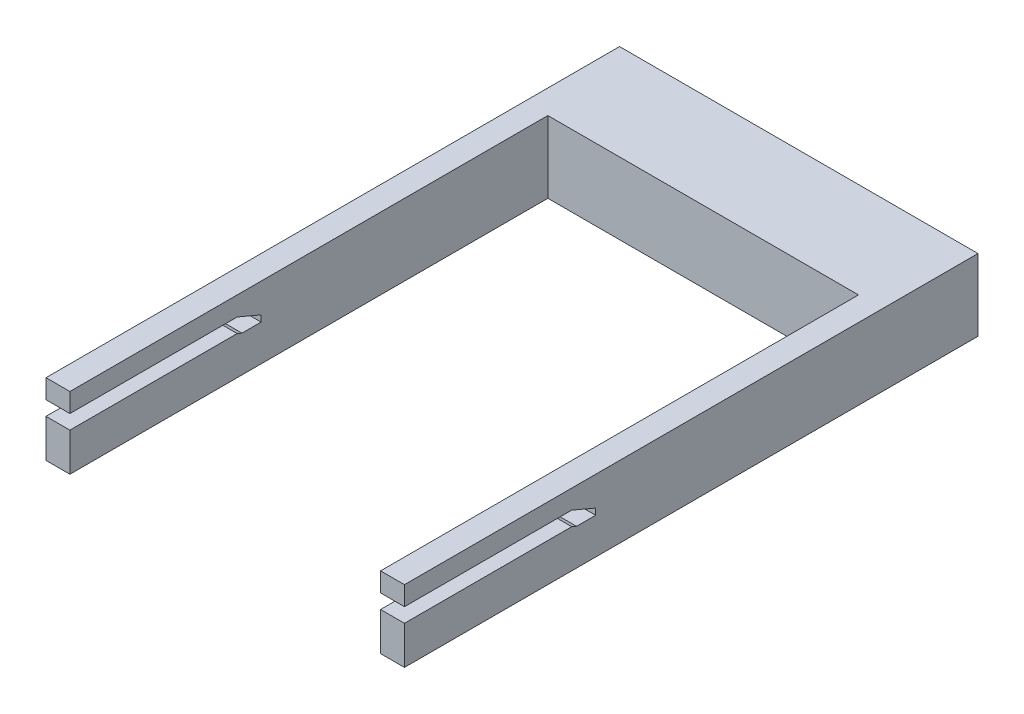
ISO-10303-21;
HEADER;
FILE_DESCRIPTION(('STEP AP214'),'2;1');
FILE_NAME('part.step','',(''),(''),'','','');
FILE_SCHEMA(('AUTOMOTIVE_DESIGN { 1 0 10303 214 1 1 1 1 }'));
ENDSEC;
DATA;
#1=APPLICATION_CONTEXT('core data for automotive mechanical design processes');
#2=APPLICATION_PROTOCOL_DEFINITION('international standard','automotive_design',2000,#1);
#3=PRODUCT_CONTEXT('',#1,'mechanical');
#4=PRODUCT('Part','Part','',(#3));
#5=PRODUCT_RELATED_PRODUCT_CATEGORY('part','',(#4));
#6=PRODUCT_DEFINITION_FORMATION('','',#4);
#7=PRODUCT_DEFINITION_CONTEXT('part definition',#1,'design');
#8=PRODUCT_DEFINITION('design','',#6,#7);
#9=PRODUCT_DEFINITION_SHAPE('','',#8);
#10=(LENGTH_UNIT() NAMED_UNIT(*) SI_UNIT(.MILLI.,.METRE.));
#11=(NAMED_UNIT(*) PLANE_ANGLE_UNIT() SI_UNIT($,.RADIAN.));
#12=(NAMED_UNIT(*) SI_UNIT($,.STERADIAN.) SOLID_ANGLE_UNIT());
#13=UNCERTAINTY_MEASURE_WITH_UNIT(LENGTH_MEASURE(1.E-05),#10,'distance_accuracy_value','');
#14=(GEOMETRIC_REPRESENTATION_CONTEXT(3) GLOBAL_UNCERTAINTY_ASSIGNED_CONTEXT((#13)) GLOBAL_UNIT_ASSIGNED_CONTEXT((#10,
#11,#12)) REPRESENTATION_CONTEXT('',''));
#15=CARTESIAN_POINT('',(0.,0.,0.));
#16=DIRECTION('',(0.,0.,1.));
#17=DIRECTION('',(1.,0.,0.));
#18=AXIS2_PLACEMENT_3D('',#15,#16,#17);
#19=CARTESIAN_POINT('',(-37.5,15.,60.));
#20=DIRECTION('',(0.,0.,-1.));
#21=DIRECTION('',(-1.,0.,0.));
#22=AXIS2_PLACEMENT_3D('',#19,#20,#21);
#23=PLANE('',#22);
#24=DIRECTION('',(0.,-1.,0.));
#25=VECTOR('',#24,1.);
#26=CARTESIAN_POINT('',(-37.5,15.,60.));
#27=LINE('',#26,#25);
#28=CARTESIAN_POINT('',(-37.5,15.,60.));
#29=VERTEX_POINT('',#28);
#30=CARTESIAN_POINT('',(-37.5,11.,60.));
#31=VERTEX_POINT('',#30);
#32=EDGE_CURVE('E222',#29,#31,#27,.T.);
#33=ORIENTED_EDGE('',*,*,#32,.T.);
#34=DIRECTION('',(1.,0.,0.));
#35=VECTOR('',#34,1.);
#36=CARTESIAN_POINT('',(-37.5,11.,60.));
#37=LINE('',#36,#35);
#38=CARTESIAN_POINT('',(-32.5,11.,60.));
#39=VERTEX_POINT('',#38);
#40=EDGE_CURVE('E291',#31,#39,#37,.T.);
#41=ORIENTED_EDGE('',*,*,#40,.T.);
#42=DIRECTION('',(0.,-1.,0.));
#43=VECTOR('',#42,1.);
#44=CARTESIAN_POINT('',(-32.5,15.,60.));
#45=LINE('',#44,#43);
#46=CARTESIAN_POINT('',(-32.5,15.,60.));
#47=VERTEX_POINT('',#46);
#48=EDGE_CURVE('E223',#47,#39,#45,.T.);
#49=ORIENTED_EDGE('',*,*,#48,.F.);
#50=DIRECTION('',(1.,0.,0.));
#51=VECTOR('',#50,1.);
#52=CARTESIAN_POINT('',(-37.5,15.,60.));
#53=LINE('',#52,#51);
#54=EDGE_CURVE('E329',#29,#47,#53,.T.);
#55=ORIENTED_EDGE('',*,*,#54,.F.);
#56=EDGE_LOOP('',(#33,#41,#49,#55));
#57=FACE_BOUND('',#56,.T.);
#58=ADVANCED_FACE('F43',(#57),#23,.F.);
#59=CARTESIAN_POINT('',(32.5,15.,60.));
#60=DIRECTION('',(0.,0.,-1.));
#61=DIRECTION('',(-1.,0.,0.));
#62=AXIS2_PLACEMENT_3D('',#59,#60,#61);
#63=PLANE('',#62);
#64=DIRECTION('',(0.,-1.,0.));
#65=VECTOR('',#64,1.);
#66=CARTESIAN_POINT('',(32.5,15.,60.));
#67=LINE('',#66,#65);
#68=CARTESIAN_POINT('',(32.5,15.,60.));
#69=VERTEX_POINT('',#68);
#70=CARTESIAN_POINT('',(32.5,11.,60.));
#71=VERTEX_POINT('',#70);
#72=EDGE_CURVE('E374',#69,#71,#67,.T.);
#73=ORIENTED_EDGE('',*,*,#72,.T.);
#74=DIRECTION('',(1.,0.,0.));
#75=VECTOR('',#74,1.);
#76=CARTESIAN_POINT('',(32.5,11.,60.));
#77=LINE('',#76,#75);
#78=CARTESIAN_POINT('',(37.5,11.,60.));
#79=VERTEX_POINT('',#78);
#80=EDGE_CURVE('E242',#71,#79,#77,.T.);
#81=ORIENTED_EDGE('',*,*,#80,.T.);
#82=DIRECTION('',(0.,-1.,0.));
#83=VECTOR('',#82,1.);
#84=CARTESIAN_POINT('',(37.5,15.,60.));
#85=LINE('',#84,#83);
#86=CARTESIAN_POINT('',(37.5,15.,60.));
#87=VERTEX_POINT('',#86);
#88=EDGE_CURVE('E369',#87,#79,#85,.T.);
#89=ORIENTED_EDGE('',*,*,#88,.F.);
#90=DIRECTION('',(1.,0.,0.));
#91=VECTOR('',#90,1.);
#92=CARTESIAN_POINT('',(32.5,15.,60.));
#93=LINE('',#92,#91);
#94=EDGE_CURVE('E341',#69,#87,#93,.T.);
#95=ORIENTED_EDGE('',*,*,#94,.F.);
#96=EDGE_LOOP('',(#73,#81,#89,#95));
#97=FACE_BOUND('',#96,.T.);
#98=ADVANCED_FACE('F483',(#97),#63,.F.);
#99=CARTESIAN_POINT('',(37.5,15.,-60.));
#100=DIRECTION('',(-1.,0.,0.));
#101=DIRECTION('',(0.,0.,1.));
#102=AXIS2_PLACEMENT_3D('',#99,#100,#101);
#103=PLANE('',#102);
#104=ORIENTED_EDGE('',*,*,#88,.T.);
#105=DIRECTION('',(0.,0.,1.));
#106=VECTOR('',#105,1.);
#107=CARTESIAN_POINT('',(37.5,11.,60.));
#108=LINE('',#107,#106);
#109=CARTESIAN_POINT('',(37.5,11.,25.));
#110=VERTEX_POINT('',#109);
#111=EDGE_CURVE('E202',#110,#79,#108,.T.);
#112=ORIENTED_EDGE('',*,*,#111,.F.);
#113=DIRECTION('',(0.,0.390731128489274,0.92050485345244));
#114=VECTOR('',#113,1.);
#115=CARTESIAN_POINT('',(37.5,11.,25.));
#116=LINE('',#115,#114);
#117=CARTESIAN_POINT('',(37.5,8.87762591895197,20.));
#118=VERTEX_POINT('',#117);
#119=EDGE_CURVE('E424',#118,#110,#116,.T.);
#120=ORIENTED_EDGE('',*,*,#119,.F.);
#121=DIRECTION('',(0.,1.,0.));
#122=VECTOR('',#121,1.);
#123=CARTESIAN_POINT('',(37.5,8.87762591895197,20.));
#124=LINE('',#123,#122);
#125=CARTESIAN_POINT('',(37.5,7.5755251837904,20.));
#126=VERTEX_POINT('',#125);
#127=EDGE_CURVE('E428',#126,#118,#124,.T.);
#128=ORIENTED_EDGE('',*,*,#127,.F.);
#129=DIRECTION('',(0.,0.,-1.));
#130=VECTOR('',#129,1.);
#131=CARTESIAN_POINT('',(37.5,7.5755251837904,20.));
#132=LINE('',#131,#130);
#133=CARTESIAN_POINT('',(37.5,7.57552518379039,24.));
#134=VERTEX_POINT('',#133);
#135=EDGE_CURVE('E270',#134,#126,#132,.T.);
#136=ORIENTED_EDGE('',*,*,#135,.F.);
#137=DIRECTION('',(0.,-0.390731128489276,-0.920504853452439));
#138=VECTOR('',#137,1.);
#139=CARTESIAN_POINT('',(37.5,7.57552518379039,24.));
#140=LINE('',#139,#138);
#141=CARTESIAN_POINT('',(37.5,8.,25.));
#142=VERTEX_POINT('',#141);
#143=EDGE_CURVE('E433',#142,#134,#140,.T.);
#144=ORIENTED_EDGE('',*,*,#143,.F.);
#145=DIRECTION('',(0.,0.,-1.));
#146=VECTOR('',#145,1.);
#147=CARTESIAN_POINT('',(37.5,8.,25.));
#148=LINE('',#147,#146);
#149=CARTESIAN_POINT('',(37.5,8.,60.));
#150=VERTEX_POINT('',#149);
#151=EDGE_CURVE('E437',#150,#142,#148,.T.);
#152=ORIENTED_EDGE('',*,*,#151,.F.);
#153=CARTESIAN_POINT('',(37.5,0.,60.));
#154=VERTEX_POINT('',#153);
#155=EDGE_CURVE('E344',#150,#154,#85,.T.);
#156=ORIENTED_EDGE('',*,*,#155,.T.);
#157=DIRECTION('',(0.,0.,-1.));
#158=VECTOR('',#157,1.);
#159=CARTESIAN_POINT('',(37.5,0.,-60.));
#160=LINE('',#159,#158);
#161=CARTESIAN_POINT('',(37.5,0.,-60.));
#162=VERTEX_POINT('',#161);
#163=EDGE_CURVE('E317',#154,#162,#160,.T.);
#164=ORIENTED_EDGE('',*,*,#163,.T.);
#165=DIRECTION('',(0.,-1.,0.));
#166=VECTOR('',#165,1.);
#167=CARTESIAN_POINT('',(37.5,15.,-60.));
#168=LINE('',#167,#166);
#169=CARTESIAN_POINT('',(37.5,15.,-60.));
#170=VERTEX_POINT('',#169);
#171=EDGE_CURVE('E235',#170,#162,#168,.T.);
#172=ORIENTED_EDGE('',*,*,#171,.F.);
#173=DIRECTION('',(0.,0.,-1.));
#174=VECTOR('',#173,1.);
#175=CARTESIAN_POINT('',(37.5,15.,-60.));
#176=LINE('',#175,#174);
#177=EDGE_CURVE('E318',#87,#170,#176,.T.);
#178=ORIENTED_EDGE('',*,*,#177,.F.);
#179=EDGE_LOOP('',(#104,#112,#120,#128,#136,#144,#152,#156,#164,#172,#178));
#180=FACE_BOUND('',#179,.T.);
#181=ADVANCED_FACE('F45',(#180),#103,.F.);
#182=CARTESIAN_POINT('',(-37.5,15.,-60.));
#183=DIRECTION('',(0.,0.,1.));
#184=DIRECTION('',(1.,0.,0.));
#185=AXIS2_PLACEMENT_3D('',#182,#183,#184);
#186=PLANE('',#185);
#187=DIRECTION('',(-1.,0.,0.));
#188=VECTOR('',#187,1.);
#189=CARTESIAN_POINT('',(-37.5,0.,-60.));
#190=LINE('',#189,#188);
#191=CARTESIAN_POINT('',(-37.5,0.,-60.));
#192=VERTEX_POINT('',#191);
#193=EDGE_CURVE('E348',#162,#192,#190,.T.);
#194=ORIENTED_EDGE('',*,*,#193,.T.);
#195=DIRECTION('',(0.,-1.,0.));
#196=VECTOR('',#195,1.);
#197=CARTESIAN_POINT('',(-37.5,15.,-60.));
#198=LINE('',#197,#196);
#199=CARTESIAN_POINT('',(-37.5,15.,-60.));
#200=VERTEX_POINT('',#199);
#201=EDGE_CURVE('E228',#200,#192,#198,.T.);
#202=ORIENTED_EDGE('',*,*,#201,.F.);
#203=DIRECTION('',(-1.,0.,0.));
#204=VECTOR('',#203,1.);
#205=CARTESIAN_POINT('',(-37.5,15.,-60.));
#206=LINE('',#205,#204);
#207=EDGE_CURVE('E322',#170,#200,#206,.T.);
#208=ORIENTED_EDGE('',*,*,#207,.F.);
#209=ORIENTED_EDGE('',*,*,#171,.T.);
#210=EDGE_LOOP('',(#194,#202,#208,#209));
#211=FACE_BOUND('',#210,.T.);
#212=ADVANCED_FACE('F498',(#211),#186,.F.);
#213=CARTESIAN_POINT('',(-37.5,15.,-60.));
#214=DIRECTION('',(1.,0.,0.));
#215=DIRECTION('',(0.,0.,-1.));
#216=AXIS2_PLACEMENT_3D('',#213,#214,#215);
#217=PLANE('',#216);
#218=DIRECTION('',(0.,0.390731128489274,0.92050485345244));
#219=VECTOR('',#218,1.);
#220=CARTESIAN_POINT('',(-37.5,11.,25.));
#221=LINE('',#220,#219);
#222=CARTESIAN_POINT('',(-37.5,8.87762591895197,20.));
#223=VERTEX_POINT('',#222);
#224=CARTESIAN_POINT('',(-37.5,11.,25.));
#225=VERTEX_POINT('',#224);
#226=EDGE_CURVE('E443',#223,#225,#221,.T.);
#227=ORIENTED_EDGE('',*,*,#226,.T.);
#228=DIRECTION('',(0.,0.,1.));
#229=VECTOR('',#228,1.);
#230=CARTESIAN_POINT('',(-37.5,11.,60.));
#231=LINE('',#230,#229);
#232=EDGE_CURVE('E213',#225,#31,#231,.T.);
#233=ORIENTED_EDGE('',*,*,#232,.T.);
#234=ORIENTED_EDGE('',*,*,#32,.F.);
#235=DIRECTION('',(0.,0.,1.));
#236=VECTOR('',#235,1.);
#237=CARTESIAN_POINT('',(-37.5,15.,-60.));
#238=LINE('',#237,#236);
#239=EDGE_CURVE('E326',#200,#29,#238,.T.);
#240=ORIENTED_EDGE('',*,*,#239,.F.);
#241=ORIENTED_EDGE('',*,*,#201,.T.);
#242=DIRECTION('',(0.,0.,1.));
#243=VECTOR('',#242,1.);
#244=CARTESIAN_POINT('',(-37.5,0.,-60.));
#245=LINE('',#244,#243);
#246=CARTESIAN_POINT('',(-37.5,0.,60.));
#247=VERTEX_POINT('',#246);
#248=EDGE_CURVE('E219',#192,#247,#245,.T.);
#249=ORIENTED_EDGE('',*,*,#248,.T.);
#250=CARTESIAN_POINT('',(-37.5,8.,60.));
#251=VERTEX_POINT('',#250);
#252=EDGE_CURVE('E208',#251,#247,#27,.T.);
#253=ORIENTED_EDGE('',*,*,#252,.F.);
#254=DIRECTION('',(0.,0.,-1.));
#255=VECTOR('',#254,1.);
#256=CARTESIAN_POINT('',(-37.5,8.,25.));
#257=LINE('',#256,#255);
#258=CARTESIAN_POINT('',(-37.5,8.,25.));
#259=VERTEX_POINT('',#258);
#260=EDGE_CURVE('E192',#251,#259,#257,.T.);
#261=ORIENTED_EDGE('',*,*,#260,.T.);
#262=DIRECTION('',(0.,-0.390731128489276,-0.920504853452439));
#263=VECTOR('',#262,1.);
#264=CARTESIAN_POINT('',(-37.5,7.57552518379039,24.));
#265=LINE('',#264,#263);
#266=CARTESIAN_POINT('',(-37.5,7.57552518379039,24.));
#267=VERTEX_POINT('',#266);
#268=EDGE_CURVE('E201',#259,#267,#265,.T.);
#269=ORIENTED_EDGE('',*,*,#268,.T.);
#270=DIRECTION('',(0.,0.,-1.));
#271=VECTOR('',#270,1.);
#272=CARTESIAN_POINT('',(-37.5,7.5755251837904,20.));
#273=LINE('',#272,#271);
#274=CARTESIAN_POINT('',(-37.5,7.5755251837904,20.));
#275=VERTEX_POINT('',#274);
#276=EDGE_CURVE('E450',#267,#275,#273,.T.);
#277=ORIENTED_EDGE('',*,*,#276,.T.);
#278=DIRECTION('',(0.,1.,0.));
#279=VECTOR('',#278,1.);
#280=CARTESIAN_POINT('',(-37.5,8.87762591895197,20.));
#281=LINE('',#280,#279);
#282=EDGE_CURVE('E446',#275,#223,#281,.T.);
#283=ORIENTED_EDGE('',*,*,#282,.T.);
#284=EDGE_LOOP('',(#227,#233,#234,#240,#241,#249,#253,#261,#269,#277,#283));
#285=FACE_BOUND('',#284,.T.);
#286=ADVANCED_FACE('F216',(#285),#217,.F.);
#287=CARTESIAN_POINT('',(-32.5,8.,60.));
#288=VERTEX_POINT('',#287);
#289=CARTESIAN_POINT('',(-32.5,0.,60.));
#290=VERTEX_POINT('',#289);
#291=EDGE_CURVE('E210',#288,#290,#45,.T.);
#292=ORIENTED_EDGE('',*,*,#291,.F.);
#293=DIRECTION('',(1.,0.,0.));
#294=VECTOR('',#293,1.);
#295=CARTESIAN_POINT('',(-37.5,8.,60.));
#296=LINE('',#295,#294);
#297=EDGE_CURVE('E59',#251,#288,#296,.T.);
#298=ORIENTED_EDGE('',*,*,#297,.F.);
#299=ORIENTED_EDGE('',*,*,#252,.T.);
#300=DIRECTION('',(1.,0.,0.));
#301=VECTOR('',#300,1.);
#302=CARTESIAN_POINT('',(-37.5,0.,60.));
#303=LINE('',#302,#301);
#304=EDGE_CURVE('E353',#247,#290,#303,.T.);
#305=ORIENTED_EDGE('',*,*,#304,.T.);
#306=EDGE_LOOP('',(#292,#298,#299,#305));
#307=FACE_BOUND('',#306,.T.);
#308=ADVANCED_FACE('F206',(#307),#23,.F.);
#309=CARTESIAN_POINT('',(-32.5,15.,-40.));
#310=DIRECTION('',(-1.,0.,0.));
#311=DIRECTION('',(0.,0.,1.));
#312=AXIS2_PLACEMENT_3D('',#309,#310,#311);
#313=PLANE('',#312);
#314=ORIENTED_EDGE('',*,*,#48,.T.);
#315=DIRECTION('',(0.,0.,-1.));
#316=VECTOR('',#315,1.);
#317=CARTESIAN_POINT('',(-32.5,11.,-40.));
#318=LINE('',#317,#316);
#319=CARTESIAN_POINT('',(-32.5,11.,25.));
#320=VERTEX_POINT('',#319);
#321=EDGE_CURVE('E297',#39,#320,#318,.T.);
#322=ORIENTED_EDGE('',*,*,#321,.T.);
#323=DIRECTION('',(0.,-0.390731128489274,-0.92050485345244));
#324=VECTOR('',#323,1.);
#325=CARTESIAN_POINT('',(-32.5,-11.7678602519242,-28.6377174392401));
#326=LINE('',#325,#324);
#327=CARTESIAN_POINT('',(-32.5,8.87762591895197,20.));
#328=VERTEX_POINT('',#327);
#329=EDGE_CURVE('E313',#320,#328,#326,.T.);
#330=ORIENTED_EDGE('',*,*,#329,.T.);
#331=DIRECTION('',(0.,-1.,0.));
#332=VECTOR('',#331,1.);
#333=CARTESIAN_POINT('',(-32.5,15.,20.));
#334=LINE('',#333,#332);
#335=CARTESIAN_POINT('',(-32.5,7.5755251837904,20.));
#336=VERTEX_POINT('',#335);
#337=EDGE_CURVE('E309',#328,#336,#334,.T.);
#338=ORIENTED_EDGE('',*,*,#337,.T.);
#339=DIRECTION('',(0.,0.,1.));
#340=VECTOR('',#339,1.);
#341=CARTESIAN_POINT('',(-32.5,7.57552518379042,-40.));
#342=LINE('',#341,#340);
#343=CARTESIAN_POINT('',(-32.5,7.57552518379039,24.));
#344=VERTEX_POINT('',#343);
#345=EDGE_CURVE('E305',#336,#344,#342,.T.);
#346=ORIENTED_EDGE('',*,*,#345,.T.);
#347=DIRECTION('',(0.,0.390731128489276,0.920504853452439));
#348=VECTOR('',#347,1.);
#349=CARTESIAN_POINT('',(-32.5,-14.3098478076127,-27.558707738732));
#350=LINE('',#349,#348);
#351=CARTESIAN_POINT('',(-32.5,8.,25.));
#352=VERTEX_POINT('',#351);
#353=EDGE_CURVE('E301',#344,#352,#350,.T.);
#354=ORIENTED_EDGE('',*,*,#353,.T.);
#355=DIRECTION('',(0.,0.,1.));
#356=VECTOR('',#355,1.);
#357=CARTESIAN_POINT('',(-32.5,8.00000000000001,-40.));
#358=LINE('',#357,#356);
#359=EDGE_CURVE('E290',#352,#288,#358,.T.);
#360=ORIENTED_EDGE('',*,*,#359,.T.);
#361=ORIENTED_EDGE('',*,*,#291,.T.);
#362=DIRECTION('',(0.,0.,-1.));
#363=VECTOR('',#362,1.);
#364=CARTESIAN_POINT('',(-32.5,0.,-40.));
#365=LINE('',#364,#363);
#366=CARTESIAN_POINT('',(-32.5,0.,-40.));
#367=VERTEX_POINT('',#366);
#368=EDGE_CURVE('E356',#290,#367,#365,.T.);
#369=ORIENTED_EDGE('',*,*,#368,.T.);
#370=DIRECTION('',(0.,-1.,0.));
#371=VECTOR('',#370,1.);
#372=CARTESIAN_POINT('',(-32.5,15.,-40.));
#373=LINE('',#372,#371);
#374=CARTESIAN_POINT('',(-32.5,15.,-40.));
#375=VERTEX_POINT('',#374);
#376=EDGE_CURVE('E381',#375,#367,#373,.T.);
#377=ORIENTED_EDGE('',*,*,#376,.F.);
#378=DIRECTION('',(0.,0.,-1.));
#379=VECTOR('',#378,1.);
#380=CARTESIAN_POINT('',(-32.5,15.,-40.));
#381=LINE('',#380,#379);
#382=EDGE_CURVE('E332',#47,#375,#381,.T.);
#383=ORIENTED_EDGE('',*,*,#382,.F.);
#384=EDGE_LOOP('',(#314,#322,#330,#338,#346,#354,#360,#361,#369,#377,#383));
#385=FACE_BOUND('',#384,.T.);
#386=ADVANCED_FACE('F390',(#385),#313,.F.);
#387=CARTESIAN_POINT('',(-32.5,15.,-40.));
#388=DIRECTION('',(0.,0.,-1.));
#389=DIRECTION('',(-1.,0.,0.));
#390=AXIS2_PLACEMENT_3D('',#387,#388,#389);
#391=PLANE('',#390);
#392=DIRECTION('',(1.,0.,0.));
#393=VECTOR('',#392,1.);
#394=CARTESIAN_POINT('',(-32.5,0.,-40.));
#395=LINE('',#394,#393);
#396=CARTESIAN_POINT('',(32.5,0.,-40.));
#397=VERTEX_POINT('',#396);
#398=EDGE_CURVE('E359',#367,#397,#395,.T.);
#399=ORIENTED_EDGE('',*,*,#398,.T.);
#400=DIRECTION('',(0.,-1.,0.));
#401=VECTOR('',#400,1.);
#402=CARTESIAN_POINT('',(32.5,15.,-40.));
#403=LINE('',#402,#401);
#404=CARTESIAN_POINT('',(32.5,15.,-40.));
#405=VERTEX_POINT('',#404);
#406=EDGE_CURVE('E378',#405,#397,#403,.T.);
#407=ORIENTED_EDGE('',*,*,#406,.F.);
#408=DIRECTION('',(1.,0.,0.));
#409=VECTOR('',#408,1.);
#410=CARTESIAN_POINT('',(-32.5,15.,-40.));
#411=LINE('',#410,#409);
#412=EDGE_CURVE('E335',#375,#405,#411,.T.);
#413=ORIENTED_EDGE('',*,*,#412,.F.);
#414=ORIENTED_EDGE('',*,*,#376,.T.);
#415=EDGE_LOOP('',(#399,#407,#413,#414));
#416=FACE_BOUND('',#415,.T.);
#417=ADVANCED_FACE('F398',(#416),#391,.F.);
#418=CARTESIAN_POINT('',(32.5,15.,-40.));
#419=DIRECTION('',(1.,0.,0.));
#420=DIRECTION('',(0.,0.,-1.));
#421=AXIS2_PLACEMENT_3D('',#418,#419,#420);
#422=PLANE('',#421);
#423=DIRECTION('',(0.,0.390731128489274,0.92050485345244));
#424=VECTOR('',#423,1.);
#425=CARTESIAN_POINT('',(32.5,-11.7678602519242,-28.6377174392401));
#426=LINE('',#425,#424);
#427=CARTESIAN_POINT('',(32.5,8.87762591895197,20.));
#428=VERTEX_POINT('',#427);
#429=CARTESIAN_POINT('',(32.5,11.,25.));
#430=VERTEX_POINT('',#429);
#431=EDGE_CURVE('E11',#428,#430,#426,.T.);
#432=ORIENTED_EDGE('',*,*,#431,.T.);
#433=DIRECTION('',(0.,0.,1.));
#434=VECTOR('',#433,1.);
#435=CARTESIAN_POINT('',(32.5,11.,-40.));
#436=LINE('',#435,#434);
#437=EDGE_CURVE('E294',#430,#71,#436,.T.);
#438=ORIENTED_EDGE('',*,*,#437,.T.);
#439=ORIENTED_EDGE('',*,*,#72,.F.);
#440=DIRECTION('',(0.,0.,1.));
#441=VECTOR('',#440,1.);
#442=CARTESIAN_POINT('',(32.5,15.,-40.));
#443=LINE('',#442,#441);
#444=EDGE_CURVE('E338',#405,#69,#443,.T.);
#445=ORIENTED_EDGE('',*,*,#444,.F.);
#446=ORIENTED_EDGE('',*,*,#406,.T.);
#447=DIRECTION('',(0.,0.,1.));
#448=VECTOR('',#447,1.);
#449=CARTESIAN_POINT('',(32.5,0.,-40.));
#450=LINE('',#449,#448);
#451=CARTESIAN_POINT('',(32.5,0.,60.));
#452=VERTEX_POINT('',#451);
#453=EDGE_CURVE('E362',#397,#452,#450,.T.);
#454=ORIENTED_EDGE('',*,*,#453,.T.);
#455=CARTESIAN_POINT('',(32.5,8.,60.));
#456=VERTEX_POINT('',#455);
#457=EDGE_CURVE('E373',#456,#452,#67,.T.);
#458=ORIENTED_EDGE('',*,*,#457,.F.);
#459=DIRECTION('',(0.,0.,-1.));
#460=VECTOR('',#459,1.);
#461=CARTESIAN_POINT('',(32.5,8.00000000000001,-40.));
#462=LINE('',#461,#460);
#463=CARTESIAN_POINT('',(32.5,8.,25.));
#464=VERTEX_POINT('',#463);
#465=EDGE_CURVE('E67',#456,#464,#462,.T.);
#466=ORIENTED_EDGE('',*,*,#465,.T.);
#467=DIRECTION('',(0.,-0.390731128489276,-0.920504853452439));
#468=VECTOR('',#467,1.);
#469=CARTESIAN_POINT('',(32.5,-14.3098478076127,-27.558707738732));
#470=LINE('',#469,#468);
#471=CARTESIAN_POINT('',(32.5,7.57552518379039,24.));
#472=VERTEX_POINT('',#471);
#473=EDGE_CURVE('E246',#464,#472,#470,.T.);
#474=ORIENTED_EDGE('',*,*,#473,.T.);
#475=DIRECTION('',(0.,0.,-1.));
#476=VECTOR('',#475,1.);
#477=CARTESIAN_POINT('',(32.5,7.57552518379042,-40.));
#478=LINE('',#477,#476);
#479=CARTESIAN_POINT('',(32.5,7.5755251837904,20.));
#480=VERTEX_POINT('',#479);
#481=EDGE_CURVE('E250',#472,#480,#478,.T.);
#482=ORIENTED_EDGE('',*,*,#481,.T.);
#483=DIRECTION('',(0.,1.,0.));
#484=VECTOR('',#483,1.);
#485=CARTESIAN_POINT('',(32.5,15.,20.));
#486=LINE('',#485,#484);
#487=EDGE_CURVE('E52',#480,#428,#486,.T.);
#488=ORIENTED_EDGE('',*,*,#487,.T.);
#489=EDGE_LOOP('',(#432,#438,#439,#445,#446,#454,#458,#466,#474,#482,#488));
#490=FACE_BOUND('',#489,.T.);
#491=ADVANCED_FACE('F256',(#490),#422,.F.);
#492=ORIENTED_EDGE('',*,*,#155,.F.);
#493=DIRECTION('',(-1.,0.,0.));
#494=VECTOR('',#493,1.);
#495=CARTESIAN_POINT('',(32.5,8.,60.));
#496=LINE('',#495,#494);
#497=EDGE_CURVE('E239',#150,#456,#496,.T.);
#498=ORIENTED_EDGE('',*,*,#497,.T.);
#499=ORIENTED_EDGE('',*,*,#457,.T.);
#500=DIRECTION('',(1.,0.,0.));
#501=VECTOR('',#500,1.);
#502=CARTESIAN_POINT('',(32.5,0.,60.));
#503=LINE('',#502,#501);
#504=EDGE_CURVE('E323',#452,#154,#503,.T.);
#505=ORIENTED_EDGE('',*,*,#504,.T.);
#506=EDGE_LOOP('',(#492,#498,#499,#505));
#507=FACE_BOUND('',#506,.T.);
#508=ADVANCED_FACE('F490',(#507),#63,.F.);
#509=CARTESIAN_POINT('',(0.,15.,0.));
#510=DIRECTION('',(0.,1.,0.));
#511=DIRECTION('',(0.,0.,1.));
#512=AXIS2_PLACEMENT_3D('',#509,#510,#511);
#513=PLANE('',#512);
#514=ORIENTED_EDGE('',*,*,#177,.T.);
#515=ORIENTED_EDGE('',*,*,#207,.T.);
#516=ORIENTED_EDGE('',*,*,#239,.T.);
#517=ORIENTED_EDGE('',*,*,#54,.T.);
#518=ORIENTED_EDGE('',*,*,#382,.T.);
#519=ORIENTED_EDGE('',*,*,#412,.T.);
#520=ORIENTED_EDGE('',*,*,#444,.T.);
#521=ORIENTED_EDGE('',*,*,#94,.T.);
#522=EDGE_LOOP('',(#514,#515,#516,#517,#518,#519,#520,#521));
#523=FACE_BOUND('',#522,.T.);
#524=ADVANCED_FACE('F404',(#523),#513,.T.);
#525=CARTESIAN_POINT('',(0.,0.,0.));
#526=DIRECTION('',(0.,1.,0.));
#527=DIRECTION('',(0.,0.,1.));
#528=AXIS2_PLACEMENT_3D('',#525,#526,#527);
#529=PLANE('',#528);
#530=ORIENTED_EDGE('',*,*,#163,.F.);
#531=ORIENTED_EDGE('',*,*,#504,.F.);
#532=ORIENTED_EDGE('',*,*,#453,.F.);
#533=ORIENTED_EDGE('',*,*,#398,.F.);
#534=ORIENTED_EDGE('',*,*,#368,.F.);
#535=ORIENTED_EDGE('',*,*,#304,.F.);
#536=ORIENTED_EDGE('',*,*,#248,.F.);
#537=ORIENTED_EDGE('',*,*,#193,.F.);
#538=EDGE_LOOP('',(#530,#531,#532,#533,#534,#535,#536,#537));
#539=FACE_BOUND('',#538,.T.);
#540=ADVANCED_FACE('F394',(#539),#529,.F.);
#541=CARTESIAN_POINT('',(-37.5,11.,60.));
#542=DIRECTION('',(0.,1.,0.));
#543=DIRECTION('',(0.,0.,1.));
#544=AXIS2_PLACEMENT_3D('',#541,#542,#543);
#545=PLANE('',#544);
#546=DIRECTION('',(1.,0.,0.));
#547=VECTOR('',#546,1.);
#548=CARTESIAN_POINT('',(-37.5,11.,25.));
#549=LINE('',#548,#547);
#550=EDGE_CURVE('E420',#430,#110,#549,.T.);
#551=ORIENTED_EDGE('',*,*,#550,.T.);
#552=ORIENTED_EDGE('',*,*,#111,.T.);
#553=ORIENTED_EDGE('',*,*,#80,.F.);
#554=ORIENTED_EDGE('',*,*,#437,.F.);
#555=EDGE_LOOP('',(#551,#552,#553,#554));
#556=FACE_BOUND('',#555,.T.);
#557=ADVANCED_FACE('F470',(#556),#545,.F.);
#558=CARTESIAN_POINT('',(-37.5,8.,25.));
#559=DIRECTION('',(0.,-1.,0.));
#560=DIRECTION('',(0.,0.,-1.));
#561=AXIS2_PLACEMENT_3D('',#558,#559,#560);
#562=PLANE('',#561);
#563=ORIENTED_EDGE('',*,*,#497,.F.);
#564=ORIENTED_EDGE('',*,*,#151,.T.);
#565=DIRECTION('',(1.,0.,0.));
#566=VECTOR('',#565,1.);
#567=CARTESIAN_POINT('',(-37.5,8.,25.));
#568=LINE('',#567,#566);
#569=EDGE_CURVE('E212',#464,#142,#568,.T.);
#570=ORIENTED_EDGE('',*,*,#569,.F.);
#571=ORIENTED_EDGE('',*,*,#465,.F.);
#572=EDGE_LOOP('',(#563,#564,#570,#571));
#573=FACE_BOUND('',#572,.T.);
#574=ADVANCED_FACE('F476',(#573),#562,.F.);
#575=CARTESIAN_POINT('',(-37.5,7.57552518379039,24.));
#576=DIRECTION('',(0.,-0.920504853452439,0.390731128489276));
#577=DIRECTION('',(0.,-0.390731128489276,-0.920504853452439));
#578=AXIS2_PLACEMENT_3D('',#575,#576,#577);
#579=PLANE('',#578);
#580=ORIENTED_EDGE('',*,*,#569,.T.);
#581=ORIENTED_EDGE('',*,*,#143,.T.);
#582=DIRECTION('',(1.,0.,0.));
#583=VECTOR('',#582,1.);
#584=CARTESIAN_POINT('',(-37.5,7.57552518379039,24.));
#585=LINE('',#584,#583);
#586=EDGE_CURVE('E280',#472,#134,#585,.T.);
#587=ORIENTED_EDGE('',*,*,#586,.F.);
#588=ORIENTED_EDGE('',*,*,#473,.F.);
#589=EDGE_LOOP('',(#580,#581,#587,#588));
#590=FACE_BOUND('',#589,.T.);
#591=ADVANCED_FACE('F478',(#590),#579,.F.);
#592=CARTESIAN_POINT('',(-37.5,7.5755251837904,20.));
#593=DIRECTION('',(0.,-1.,0.));
#594=DIRECTION('',(0.,0.,-1.));
#595=AXIS2_PLACEMENT_3D('',#592,#593,#594);
#596=PLANE('',#595);
#597=ORIENTED_EDGE('',*,*,#586,.T.);
#598=ORIENTED_EDGE('',*,*,#135,.T.);
#599=DIRECTION('',(1.,0.,0.));
#600=VECTOR('',#599,1.);
#601=CARTESIAN_POINT('',(-37.5,7.5755251837904,20.));
#602=LINE('',#601,#600);
#603=EDGE_CURVE('E263',#480,#126,#602,.T.);
#604=ORIENTED_EDGE('',*,*,#603,.F.);
#605=ORIENTED_EDGE('',*,*,#481,.F.);
#606=EDGE_LOOP('',(#597,#598,#604,#605));
#607=FACE_BOUND('',#606,.T.);
#608=ADVANCED_FACE('F267',(#607),#596,.F.);
#609=CARTESIAN_POINT('',(-37.5,8.87762591895197,20.));
#610=DIRECTION('',(0.,0.,-1.));
#611=DIRECTION('',(-1.,0.,0.));
#612=AXIS2_PLACEMENT_3D('',#609,#610,#611);
#613=PLANE('',#612);
#614=ORIENTED_EDGE('',*,*,#603,.T.);
#615=ORIENTED_EDGE('',*,*,#127,.T.);
#616=DIRECTION('',(1.,0.,0.));
#617=VECTOR('',#616,1.);
#618=CARTESIAN_POINT('',(-37.5,8.87762591895197,20.));
#619=LINE('',#618,#617);
#620=EDGE_CURVE('E265',#428,#118,#619,.T.);
#621=ORIENTED_EDGE('',*,*,#620,.F.);
#622=ORIENTED_EDGE('',*,*,#487,.F.);
#623=EDGE_LOOP('',(#614,#615,#621,#622));
#624=FACE_BOUND('',#623,.T.);
#625=ADVANCED_FACE('F261',(#624),#613,.F.);
#626=CARTESIAN_POINT('',(-37.5,11.,25.));
#627=DIRECTION('',(0.,0.92050485345244,-0.390731128489274));
#628=DIRECTION('',(0.,0.390731128489274,0.92050485345244));
#629=AXIS2_PLACEMENT_3D('',#626,#627,#628);
#630=PLANE('',#629);
#631=ORIENTED_EDGE('',*,*,#620,.T.);
#632=ORIENTED_EDGE('',*,*,#119,.T.);
#633=ORIENTED_EDGE('',*,*,#550,.F.);
#634=ORIENTED_EDGE('',*,*,#431,.F.);
#635=EDGE_LOOP('',(#631,#632,#633,#634));
#636=FACE_BOUND('',#635,.T.);
#637=ADVANCED_FACE('F524',(#636),#630,.F.);
#638=EDGE_CURVE('E416',#225,#320,#549,.T.);
#639=ORIENTED_EDGE('',*,*,#638,.F.);
#640=ORIENTED_EDGE('',*,*,#226,.F.);
#641=EDGE_CURVE('E283',#223,#328,#619,.T.);
#642=ORIENTED_EDGE('',*,*,#641,.T.);
#643=ORIENTED_EDGE('',*,*,#329,.F.);
#644=EDGE_LOOP('',(#639,#640,#642,#643));
#645=FACE_BOUND('',#644,.T.);
#646=ADVANCED_FACE('F466',(#645),#630,.F.);
#647=ORIENTED_EDGE('',*,*,#641,.F.);
#648=ORIENTED_EDGE('',*,*,#282,.F.);
#649=EDGE_CURVE('E273',#275,#336,#602,.T.);
#650=ORIENTED_EDGE('',*,*,#649,.T.);
#651=ORIENTED_EDGE('',*,*,#337,.F.);
#652=EDGE_LOOP('',(#647,#648,#650,#651));
#653=FACE_BOUND('',#652,.T.);
#654=ADVANCED_FACE('F462',(#653),#613,.F.);
#655=ORIENTED_EDGE('',*,*,#649,.F.);
#656=ORIENTED_EDGE('',*,*,#276,.F.);
#657=EDGE_CURVE('E274',#267,#344,#585,.T.);
#658=ORIENTED_EDGE('',*,*,#657,.T.);
#659=ORIENTED_EDGE('',*,*,#345,.F.);
#660=EDGE_LOOP('',(#655,#656,#658,#659));
#661=FACE_BOUND('',#660,.T.);
#662=ADVANCED_FACE('F459',(#661),#596,.F.);
#663=ORIENTED_EDGE('',*,*,#657,.F.);
#664=ORIENTED_EDGE('',*,*,#268,.F.);
#665=EDGE_CURVE('E195',#259,#352,#568,.T.);
#666=ORIENTED_EDGE('',*,*,#665,.T.);
#667=ORIENTED_EDGE('',*,*,#353,.F.);
#668=EDGE_LOOP('',(#663,#664,#666,#667));
#669=FACE_BOUND('',#668,.T.);
#670=ADVANCED_FACE('F457',(#669),#579,.F.);
#671=ORIENTED_EDGE('',*,*,#40,.F.);
#672=ORIENTED_EDGE('',*,*,#232,.F.);
#673=ORIENTED_EDGE('',*,*,#638,.T.);
#674=ORIENTED_EDGE('',*,*,#321,.F.);
#675=EDGE_LOOP('',(#671,#672,#673,#674));
#676=FACE_BOUND('',#675,.T.);
#677=ADVANCED_FACE('F467',(#676),#545,.F.);
#678=ORIENTED_EDGE('',*,*,#665,.F.);
#679=ORIENTED_EDGE('',*,*,#260,.F.);
#680=ORIENTED_EDGE('',*,*,#297,.T.);
#681=ORIENTED_EDGE('',*,*,#359,.F.);
#682=EDGE_LOOP('',(#678,#679,#680,#681));
#683=FACE_BOUND('',#682,.T.);
#684=ADVANCED_FACE('F193',(#683),#562,.F.);
#685=CLOSED_SHELL('',(#58,#98,#181,#212,#286,#308,#386,#417,#491,#508,#524,#540,#557,#574,#591,
#608,#625,#637,#646,#654,#662,#670,#677,#684));
#686=MANIFOLD_SOLID_BREP('B2',#685);
#687=ADVANCED_BREP_SHAPE_REPRESENTATION('',(#18,#686),#14);
#688=SHAPE_DEFINITION_REPRESENTATION(#9,#687);
ENDSEC;
END-ISO-10303-21;
